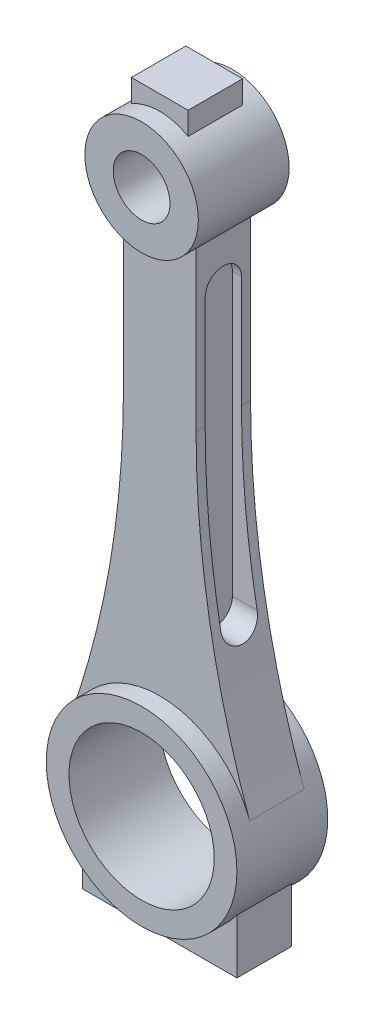
ISO-10303-21;
HEADER;
FILE_DESCRIPTION(('STEP AP214'),'2;1');
FILE_NAME('part.step','',(''),(''),'','','');
FILE_SCHEMA(('AUTOMOTIVE_DESIGN { 1 0 10303 214 1 1 1 1 }'));
ENDSEC;
DATA;
#1=APPLICATION_CONTEXT('core data for automotive mechanical design processes');
#2=APPLICATION_PROTOCOL_DEFINITION('international standard','automotive_design',2000,#1);
#3=PRODUCT_CONTEXT('',#1,'mechanical');
#4=PRODUCT('Part','Part','',(#3));
#5=PRODUCT_RELATED_PRODUCT_CATEGORY('part','',(#4));
#6=PRODUCT_DEFINITION_FORMATION('','',#4);
#7=PRODUCT_DEFINITION_CONTEXT('part definition',#1,'design');
#8=PRODUCT_DEFINITION('design','',#6,#7);
#9=PRODUCT_DEFINITION_SHAPE('','',#8);
#10=(LENGTH_UNIT() NAMED_UNIT(*) SI_UNIT(.MILLI.,.METRE.));
#11=(NAMED_UNIT(*) PLANE_ANGLE_UNIT() SI_UNIT($,.RADIAN.));
#12=(NAMED_UNIT(*) SI_UNIT($,.STERADIAN.) SOLID_ANGLE_UNIT());
#13=UNCERTAINTY_MEASURE_WITH_UNIT(LENGTH_MEASURE(1.E-05),#10,'distance_accuracy_value','');
#14=(GEOMETRIC_REPRESENTATION_CONTEXT(3) GLOBAL_UNCERTAINTY_ASSIGNED_CONTEXT((#13)) GLOBAL_UNIT_ASSIGNED_CONTEXT((#10,
#11,#12)) REPRESENTATION_CONTEXT('',''));
#15=CARTESIAN_POINT('',(0.,0.,0.));
#16=DIRECTION('',(0.,0.,1.));
#17=DIRECTION('',(1.,0.,0.));
#18=AXIS2_PLACEMENT_3D('',#15,#16,#17);
#19=CARTESIAN_POINT('',(212.132819979024,75.3953136438507,6.));
#20=DIRECTION('',(0.,0.,-1.));
#21=DIRECTION('',(-1.,0.,0.));
#22=AXIS2_PLACEMENT_3D('',#19,#20,#21);
#23=CYLINDRICAL_SURFACE('',#22,204.132819979024);
#24=CARTESIAN_POINT('',(11.4544735884215,38.,-4.));
#25=CARTESIAN_POINT('',(11.4757515518411,37.8858086335559,-4.00000967356235));
#26=CARTESIAN_POINT('',(11.497127848932,37.7716411229782,-3.99511012112079));
#27=CARTESIAN_POINT('',(11.5399210356049,37.544152772884,-3.97557755361703));
#28=CARTESIAN_POINT('',(11.5613379239584,37.4308319082382,-3.96094482861379));
#29=CARTESIAN_POINT('',(11.6040518019029,37.2058589467753,-3.92203609087537));
#30=CARTESIAN_POINT('',(11.6253488219802,37.0942064124742,-3.89776265395077));
#31=CARTESIAN_POINT('',(11.6676599337569,36.8733657612217,-3.8397587276263));
#32=CARTESIAN_POINT('',(11.6886740293759,36.7641776101131,-3.80602836938936));
#33=CARTESIAN_POINT('',(11.7510730473326,36.4413470108117,-3.69089420326937));
#34=CARTESIAN_POINT('',(11.7918289081029,36.2323636826891,-3.59553432969807));
#35=CARTESIAN_POINT('',(11.8702126062764,35.833491871712,-3.37027556179513));
#36=CARTESIAN_POINT('',(11.9078413597511,35.643597793309,-3.24038682968163));
#37=CARTESIAN_POINT('',(11.9784728244352,35.2894796680367,-2.950436910244));
#38=CARTESIAN_POINT('',(12.0115036519544,35.1250988255321,-2.79057453802655));
#39=CARTESIAN_POINT('',(12.0720036427705,34.8256035029566,-2.44449926104124));
#40=CARTESIAN_POINT('',(12.0994724370193,34.6904909648341,-2.25828460915733));
#41=CARTESIAN_POINT('',(12.1473413477104,34.4559602912754,-1.86832249559896));
#42=CARTESIAN_POINT('',(12.1678582991115,34.3559510460777,-1.664944991045));
#43=CARTESIAN_POINT('',(12.201667760202,34.1915558050773,-1.24372237948287));
#44=CARTESIAN_POINT('',(12.2149615713728,34.1271633917176,-1.0258798867516));
#45=CARTESIAN_POINT('',(12.2336033492387,34.0369591960168,-0.586274812122699));
#46=CARTESIAN_POINT('',(12.2390950212481,34.0104496060439,-0.364661335561849));
#47=CARTESIAN_POINT('',(12.2423732155318,33.9946184843632,0.0799443502249465));
#48=CARTESIAN_POINT('',(12.2401601145853,34.0052951341723,0.302936491499039));
#49=CARTESIAN_POINT('',(12.2281765408432,34.0632127244266,0.741781925824318));
#50=CARTESIAN_POINT('',(12.2184766498272,34.1101121767816,0.957682365575705));
#51=CARTESIAN_POINT('',(12.1919895794175,34.2385791029979,1.37844153266758));
#52=CARTESIAN_POINT('',(12.1752023313576,34.3201469127454,1.58330015300715));
#53=CARTESIAN_POINT('',(12.1350793834177,34.5159552856904,1.97739776157501));
#54=CARTESIAN_POINT('',(12.1117098081663,34.6303649264094,2.16654921549123));
#55=CARTESIAN_POINT('',(12.0593260749272,34.8882465100265,2.52297125984128));
#56=CARTESIAN_POINT('',(12.0303117725958,35.0317191961119,2.69024129055299));
#57=CARTESIAN_POINT('',(11.9671383735568,35.3461665633751,3.00114206510914));
#58=CARTESIAN_POINT('',(11.9329025496514,35.5175545383741,3.14433904981939));
#59=CARTESIAN_POINT('',(11.8607975408037,35.8812712267655,3.40006280722765));
#60=CARTESIAN_POINT('',(11.8229268395298,36.0736086840292,3.51257670427657));
#61=CARTESIAN_POINT('',(11.744011046999,36.4777513253325,3.70593438635492));
#62=CARTESIAN_POINT('',(11.7029182624971,36.6898643551292,3.78611370956408));
#63=CARTESIAN_POINT('',(11.6195357198389,37.1241795414682,3.90944320644275));
#64=CARTESIAN_POINT('',(11.5772477716993,37.3463667203578,3.95264656840455));
#65=CARTESIAN_POINT('',(11.5215540274852,37.6417241762258,3.98457340087695));
#66=CARTESIAN_POINT('',(11.5080944382148,37.713314753212,3.99036111817269));
#67=CARTESIAN_POINT('',(11.481236818834,37.8565916807733,3.99806924003837));
#68=CARTESIAN_POINT('',(11.4678387235409,37.9282776734255,3.99999606757805));
#69=CARTESIAN_POINT('',(11.4544735884214,38.,4.));
#70=B_SPLINE_CURVE_WITH_KNOTS('',3,(#24,#25,#26,#27,#28,#29,#30,#31,#32,#33,#34,#35,#36,#37,#38,
#39,#40,#41,#42,#43,#44,#45,#46,#47,#48,#49,#50,#51,#52,#53,#54,#55,#56,#57,#58,#59,#60,#61,#62,
#63,#64,#65,#66,#67,#68,#69),.UNSPECIFIED.,.F.,.F.,(4,2,2,2,2,2,2,2,2,2,2,2,2,2,2,2,2,2,2,2,2,2,
4),(0.,0.348357600629778,0.696704820295753,1.044959030908,1.39320841164154,2.0894785742732,
2.78554404346982,3.47714614167072,4.1687941135383,4.84816302804555,5.52740949173435,
6.19397531687089,6.86050854603355,7.52083364695974,8.18116514562693,8.84495910470897,
9.50877004017899,10.1834922182609,10.8584970981523,11.546741507572,12.2339942357505,
12.4531452672714,12.6719314158043),.UNSPECIFIED.);
#71=CARTESIAN_POINT('',(11.4544735884215,38.,-4.));
#72=VERTEX_POINT('',#71);
#73=CARTESIAN_POINT('',(11.4544735884215,38.,4.));
#74=VERTEX_POINT('',#73);
#75=EDGE_CURVE('E12',#72,#74,#70,.T.);
#76=ORIENTED_EDGE('',*,*,#75,.T.);
#77=CARTESIAN_POINT('',(212.132819979024,75.3953136438507,4.));
#78=DIRECTION('',(0.,0.,-1.));
#79=DIRECTION('',(-1.,0.,0.));
#80=AXIS2_PLACEMENT_3D('',#77,#78,#79);
#81=CIRCLE('',#80,204.132819979024);
#82=CARTESIAN_POINT('',(8.,75.3953136438507,4.));
#83=VERTEX_POINT('',#82);
#84=EDGE_CURVE('E245',#74,#83,#81,.T.);
#85=ORIENTED_EDGE('',*,*,#84,.T.);
#86=DIRECTION('',(0.,0.,-1.));
#87=VECTOR('',#86,1.);
#88=CARTESIAN_POINT('',(8.,75.3953136438507,6.));
#89=LINE('',#88,#87);
#90=CARTESIAN_POINT('',(8.,75.3953136438507,6.));
#91=VERTEX_POINT('',#90);
#92=EDGE_CURVE('E394',#91,#83,#89,.T.);
#93=ORIENTED_EDGE('',*,*,#92,.F.);
#94=CARTESIAN_POINT('',(212.132819979024,75.3953136438507,6.));
#95=DIRECTION('',(0.,0.,1.));
#96=DIRECTION('',(1.,0.,0.));
#97=AXIS2_PLACEMENT_3D('',#94,#95,#96);
#98=CIRCLE('',#97,204.132819979024);
#99=CARTESIAN_POINT('',(19.7873824881444,7.03274443356764,6.));
#100=VERTEX_POINT('',#99);
#101=EDGE_CURVE('E346',#91,#100,#98,.T.);
#102=ORIENTED_EDGE('',*,*,#101,.T.);
#103=DIRECTION('',(0.,0.,-1.));
#104=VECTOR('',#103,1.);
#105=CARTESIAN_POINT('',(19.7873824881444,7.03274443356764,6.));
#106=LINE('',#105,#104);
#107=CARTESIAN_POINT('',(19.7873824881444,7.03274443356764,-6.));
#108=VERTEX_POINT('',#107);
#109=EDGE_CURVE('E363',#100,#108,#106,.T.);
#110=ORIENTED_EDGE('',*,*,#109,.T.);
#111=CARTESIAN_POINT('',(212.132819979024,75.3953136438507,-6.));
#112=DIRECTION('',(0.,0.,1.));
#113=DIRECTION('',(1.,0.,0.));
#114=AXIS2_PLACEMENT_3D('',#111,#112,#113);
#115=CIRCLE('',#114,204.132819979024);
#116=CARTESIAN_POINT('',(8.,75.3953136438507,-6.));
#117=VERTEX_POINT('',#116);
#118=EDGE_CURVE('E343',#117,#108,#115,.T.);
#119=ORIENTED_EDGE('',*,*,#118,.F.);
#120=CARTESIAN_POINT('',(8.,75.3953136438507,-4.));
#121=VERTEX_POINT('',#120);
#122=EDGE_CURVE('E393',#121,#117,#89,.T.);
#123=ORIENTED_EDGE('',*,*,#122,.F.);
#124=CARTESIAN_POINT('',(212.132819979024,75.3953136438507,-4.));
#125=DIRECTION('',(0.,0.,1.));
#126=DIRECTION('',(1.,0.,0.));
#127=AXIS2_PLACEMENT_3D('',#124,#125,#126);
#128=CIRCLE('',#127,204.132819979024);
#129=EDGE_CURVE('E66',#121,#72,#128,.T.);
#130=ORIENTED_EDGE('',*,*,#129,.T.);
#131=EDGE_LOOP('',(#76,#85,#93,#102,#110,#119,#123,#130));
#132=FACE_BOUND('',#131,.T.);
#133=ADVANCED_FACE('F45',(#132),#23,.F.);
#134=CARTESIAN_POINT('',(8.,0.,6.));
#135=DIRECTION('',(-1.,0.,0.));
#136=DIRECTION('',(0.,-1.,0.));
#137=AXIS2_PLACEMENT_3D('',#134,#135,#136);
#138=PLANE('',#137);
#139=DIRECTION('',(0.,-1.,0.));
#140=VECTOR('',#139,1.);
#141=CARTESIAN_POINT('',(8.,0.,4.));
#142=LINE('',#141,#140);
#143=CARTESIAN_POINT('',(8.,100.,4.));
#144=VERTEX_POINT('',#143);
#145=EDGE_CURVE('E59',#144,#83,#142,.T.);
#146=ORIENTED_EDGE('',*,*,#145,.F.);
#147=CARTESIAN_POINT('',(8.,100.,0.));
#148=DIRECTION('',(-1.,0.,0.));
#149=DIRECTION('',(0.,-1.,0.));
#150=AXIS2_PLACEMENT_3D('',#147,#148,#149);
#151=CIRCLE('',#150,4.);
#152=CARTESIAN_POINT('',(8.,100.,-4.));
#153=VERTEX_POINT('',#152);
#154=EDGE_CURVE('E573',#153,#144,#151,.F.);
#155=ORIENTED_EDGE('',*,*,#154,.F.);
#156=DIRECTION('',(0.,1.,0.));
#157=VECTOR('',#156,1.);
#158=CARTESIAN_POINT('',(8.,0.,-4.));
#159=LINE('',#158,#157);
#160=EDGE_CURVE('E216',#121,#153,#159,.T.);
#161=ORIENTED_EDGE('',*,*,#160,.F.);
#162=ORIENTED_EDGE('',*,*,#122,.T.);
#163=DIRECTION('',(0.,1.,0.));
#164=VECTOR('',#163,1.);
#165=CARTESIAN_POINT('',(8.,0.,-6.));
#166=LINE('',#165,#164);
#167=CARTESIAN_POINT('',(8.,110.395313643851,-6.));
#168=VERTEX_POINT('',#167);
#169=EDGE_CURVE('E366',#117,#168,#166,.T.);
#170=ORIENTED_EDGE('',*,*,#169,.T.);
#171=DIRECTION('',(0.,0.,-1.));
#172=VECTOR('',#171,1.);
#173=CARTESIAN_POINT('',(8.,110.395313643851,6.));
#174=LINE('',#173,#172);
#175=CARTESIAN_POINT('',(8.,110.395313643851,6.));
#176=VERTEX_POINT('',#175);
#177=EDGE_CURVE('E391',#176,#168,#174,.T.);
#178=ORIENTED_EDGE('',*,*,#177,.F.);
#179=DIRECTION('',(0.,1.,0.));
#180=VECTOR('',#179,1.);
#181=CARTESIAN_POINT('',(8.,0.,6.));
#182=LINE('',#181,#180);
#183=EDGE_CURVE('E349',#91,#176,#182,.T.);
#184=ORIENTED_EDGE('',*,*,#183,.F.);
#185=ORIENTED_EDGE('',*,*,#92,.T.);
#186=EDGE_LOOP('',(#146,#155,#161,#162,#170,#178,#184,#185));
#187=FACE_BOUND('',#186,.T.);
#188=ADVANCED_FACE('F508',(#187),#138,.F.);
#189=CARTESIAN_POINT('',(0.,120.,10.));
#190=DIRECTION('',(0.,0.,1.));
#191=DIRECTION('',(1.,0.,0.));
#192=AXIS2_PLACEMENT_3D('',#189,#190,#191);
#193=PLANE('',#192);
#194=CARTESIAN_POINT('',(0.,120.,10.));
#195=DIRECTION('',(0.,0.,1.));
#196=DIRECTION('',(1.,0.,0.));
#197=AXIS2_PLACEMENT_3D('',#194,#195,#196);
#198=CIRCLE('',#197,12.5);
#199=CARTESIAN_POINT('',(12.5,120.,10.));
#200=VERTEX_POINT('',#199);
#201=EDGE_CURVE('E404',#200,#200,#198,.T.);
#202=ORIENTED_EDGE('',*,*,#201,.T.);
#203=EDGE_LOOP('',(#202));
#204=FACE_BOUND('',#203,.T.);
#205=CARTESIAN_POINT('',(0.,120.,10.));
#206=DIRECTION('',(0.,0.,1.));
#207=DIRECTION('',(1.,0.,0.));
#208=AXIS2_PLACEMENT_3D('',#205,#206,#207);
#209=CIRCLE('',#208,6.25);
#210=CARTESIAN_POINT('',(6.25,120.,10.));
#211=VERTEX_POINT('',#210);
#212=EDGE_CURVE('E398',#211,#211,#209,.T.);
#213=ORIENTED_EDGE('',*,*,#212,.F.);
#214=EDGE_LOOP('',(#213));
#215=FACE_BOUND('',#214,.T.);
#216=ADVANCED_FACE('F513',(#204,#215),#193,.T.);
#217=CARTESIAN_POINT('',(0.,120.,-10.));
#218=DIRECTION('',(0.,0.,1.));
#219=DIRECTION('',(1.,0.,0.));
#220=AXIS2_PLACEMENT_3D('',#217,#218,#219);
#221=PLANE('',#220);
#222=CARTESIAN_POINT('',(0.,120.,-10.));
#223=DIRECTION('',(0.,0.,1.));
#224=DIRECTION('',(1.,0.,0.));
#225=AXIS2_PLACEMENT_3D('',#222,#223,#224);
#226=CIRCLE('',#225,12.5);
#227=CARTESIAN_POINT('',(12.5,120.,-10.));
#228=VERTEX_POINT('',#227);
#229=EDGE_CURVE('E401',#228,#228,#226,.T.);
#230=ORIENTED_EDGE('',*,*,#229,.F.);
#231=EDGE_LOOP('',(#230));
#232=FACE_BOUND('',#231,.T.);
#233=CARTESIAN_POINT('',(0.,120.,-10.));
#234=DIRECTION('',(0.,0.,1.));
#235=DIRECTION('',(1.,0.,0.));
#236=AXIS2_PLACEMENT_3D('',#233,#234,#235);
#237=CIRCLE('',#236,6.25);
#238=CARTESIAN_POINT('',(6.25,120.,-10.));
#239=VERTEX_POINT('',#238);
#240=EDGE_CURVE('E397',#239,#239,#237,.T.);
#241=ORIENTED_EDGE('',*,*,#240,.T.);
#242=EDGE_LOOP('',(#241));
#243=FACE_BOUND('',#242,.T.);
#244=ADVANCED_FACE('F524',(#232,#243),#221,.F.);
#245=CARTESIAN_POINT('',(0.,120.,10.));
#246=DIRECTION('',(0.,0.,-1.));
#247=DIRECTION('',(-1.,0.,0.));
#248=AXIS2_PLACEMENT_3D('',#245,#246,#247);
#249=CYLINDRICAL_SURFACE('',#248,12.5);
#250=DIRECTION('',(0.,0.,-1.));
#251=VECTOR('',#250,1.);
#252=CARTESIAN_POINT('',(6.25,130.825317547305,6.));
#253=LINE('',#252,#251);
#254=CARTESIAN_POINT('',(6.25,130.825317547305,6.));
#255=VERTEX_POINT('',#254);
#256=CARTESIAN_POINT('',(6.25,130.825317547305,-6.));
#257=VERTEX_POINT('',#256);
#258=EDGE_CURVE('E330',#255,#257,#253,.T.);
#259=ORIENTED_EDGE('',*,*,#258,.F.);
#260=CARTESIAN_POINT('',(0.,120.,6.));
#261=DIRECTION('',(0.,0.,1.));
#262=DIRECTION('',(1.,0.,0.));
#263=AXIS2_PLACEMENT_3D('',#260,#261,#262);
#264=CIRCLE('',#263,12.5);
#265=CARTESIAN_POINT('',(-6.25,130.825317547305,6.));
#266=VERTEX_POINT('',#265);
#267=EDGE_CURVE('E302',#255,#266,#264,.T.);
#268=ORIENTED_EDGE('',*,*,#267,.T.);
#269=DIRECTION('',(0.,0.,-1.));
#270=VECTOR('',#269,1.);
#271=CARTESIAN_POINT('',(-6.25,130.825317547305,6.));
#272=LINE('',#271,#270);
#273=CARTESIAN_POINT('',(-6.25,130.825317547305,-6.));
#274=VERTEX_POINT('',#273);
#275=EDGE_CURVE('E314',#266,#274,#272,.T.);
#276=ORIENTED_EDGE('',*,*,#275,.T.);
#277=CARTESIAN_POINT('',(0.,120.,-6.));
#278=DIRECTION('',(0.,0.,1.));
#279=DIRECTION('',(1.,0.,0.));
#280=AXIS2_PLACEMENT_3D('',#277,#278,#279);
#281=CIRCLE('',#280,12.5);
#282=EDGE_CURVE('E301',#257,#274,#281,.T.);
#283=ORIENTED_EDGE('',*,*,#282,.F.);
#284=EDGE_LOOP('',(#259,#268,#276,#283));
#285=FACE_BOUND('',#284,.T.);
#286=DIRECTION('',(0.,0.,-1.));
#287=VECTOR('',#286,1.);
#288=CARTESIAN_POINT('',(-8.,110.395313643851,6.));
#289=LINE('',#288,#287);
#290=CARTESIAN_POINT('',(-8.,110.395313643851,6.));
#291=VERTEX_POINT('',#290);
#292=CARTESIAN_POINT('',(-8.,110.395313643851,-6.));
#293=VERTEX_POINT('',#292);
#294=EDGE_CURVE('E388',#291,#293,#289,.T.);
#295=ORIENTED_EDGE('',*,*,#294,.F.);
#296=CARTESIAN_POINT('',(0.,120.,6.));
#297=DIRECTION('',(0.,0.,1.));
#298=DIRECTION('',(1.,0.,0.));
#299=AXIS2_PLACEMENT_3D('',#296,#297,#298);
#300=CIRCLE('',#299,12.5);
#301=EDGE_CURVE('E353',#291,#176,#300,.T.);
#302=ORIENTED_EDGE('',*,*,#301,.T.);
#303=ORIENTED_EDGE('',*,*,#177,.T.);
#304=CARTESIAN_POINT('',(0.,120.,-6.));
#305=DIRECTION('',(0.,0.,1.));
#306=DIRECTION('',(1.,0.,0.));
#307=AXIS2_PLACEMENT_3D('',#304,#305,#306);
#308=CIRCLE('',#307,12.5);
#309=EDGE_CURVE('E369',#293,#168,#308,.T.);
#310=ORIENTED_EDGE('',*,*,#309,.F.);
#311=EDGE_LOOP('',(#295,#302,#303,#310));
#312=FACE_BOUND('',#311,.T.);
#313=ORIENTED_EDGE('',*,*,#201,.F.);
#314=EDGE_LOOP('',(#313));
#315=FACE_BOUND('',#314,.T.);
#316=ORIENTED_EDGE('',*,*,#229,.T.);
#317=EDGE_LOOP('',(#316));
#318=FACE_BOUND('',#317,.T.);
#319=ADVANCED_FACE('F47',(#285,#312,#315,#318),#249,.T.);
#320=CARTESIAN_POINT('',(0.,120.,10.));
#321=DIRECTION('',(0.,0.,-1.));
#322=DIRECTION('',(-1.,0.,0.));
#323=AXIS2_PLACEMENT_3D('',#320,#321,#322);
#324=CYLINDRICAL_SURFACE('',#323,6.25);
#325=ORIENTED_EDGE('',*,*,#212,.T.);
#326=EDGE_LOOP('',(#325));
#327=FACE_BOUND('',#326,.T.);
#328=ORIENTED_EDGE('',*,*,#240,.F.);
#329=EDGE_LOOP('',(#328));
#330=FACE_BOUND('',#329,.T.);
#331=ADVANCED_FACE('F518',(#327,#330),#324,.F.);
#332=CARTESIAN_POINT('',(-8.,0.,6.));
#333=DIRECTION('',(-1.,0.,0.));
#334=DIRECTION('',(0.,-1.,0.));
#335=AXIS2_PLACEMENT_3D('',#332,#333,#334);
#336=PLANE('',#335);
#337=DIRECTION('',(0.,-1.,0.));
#338=VECTOR('',#337,1.);
#339=CARTESIAN_POINT('',(-8.,0.,-4.));
#340=LINE('',#339,#338);
#341=CARTESIAN_POINT('',(-8.,100.,-4.));
#342=VERTEX_POINT('',#341);
#343=CARTESIAN_POINT('',(-7.99999999999995,75.3953136438507,-4.));
#344=VERTEX_POINT('',#343);
#345=EDGE_CURVE('E268',#342,#344,#340,.T.);
#346=ORIENTED_EDGE('',*,*,#345,.F.);
#347=CARTESIAN_POINT('',(-8.,100.,0.));
#348=DIRECTION('',(-1.,0.,0.));
#349=DIRECTION('',(0.,-1.,0.));
#350=AXIS2_PLACEMENT_3D('',#347,#348,#349);
#351=CIRCLE('',#350,4.);
#352=CARTESIAN_POINT('',(-8.,100.,4.));
#353=VERTEX_POINT('',#352);
#354=EDGE_CURVE('E570',#353,#342,#351,.T.);
#355=ORIENTED_EDGE('',*,*,#354,.F.);
#356=DIRECTION('',(0.,1.,0.));
#357=VECTOR('',#356,1.);
#358=CARTESIAN_POINT('',(-8.,0.,4.));
#359=LINE('',#358,#357);
#360=CARTESIAN_POINT('',(-7.99999999999998,75.3953136438507,4.));
#361=VERTEX_POINT('',#360);
#362=EDGE_CURVE('E262',#361,#353,#359,.T.);
#363=ORIENTED_EDGE('',*,*,#362,.F.);
#364=DIRECTION('',(0.,0.,-1.));
#365=VECTOR('',#364,1.);
#366=CARTESIAN_POINT('',(-8.,75.3953136438507,6.));
#367=LINE('',#366,#365);
#368=CARTESIAN_POINT('',(-8.,75.3953136438507,6.));
#369=VERTEX_POINT('',#368);
#370=EDGE_CURVE('E385',#369,#361,#367,.T.);
#371=ORIENTED_EDGE('',*,*,#370,.F.);
#372=DIRECTION('',(0.,1.,0.));
#373=VECTOR('',#372,1.);
#374=CARTESIAN_POINT('',(-8.,0.,6.));
#375=LINE('',#374,#373);
#376=EDGE_CURVE('E355',#369,#291,#375,.T.);
#377=ORIENTED_EDGE('',*,*,#376,.T.);
#378=ORIENTED_EDGE('',*,*,#294,.T.);
#379=DIRECTION('',(0.,1.,0.));
#380=VECTOR('',#379,1.);
#381=CARTESIAN_POINT('',(-8.,0.,-6.));
#382=LINE('',#381,#380);
#383=CARTESIAN_POINT('',(-8.,75.3953136438507,-6.));
#384=VERTEX_POINT('',#383);
#385=EDGE_CURVE('E372',#384,#293,#382,.T.);
#386=ORIENTED_EDGE('',*,*,#385,.F.);
#387=EDGE_CURVE('E384',#344,#384,#367,.T.);
#388=ORIENTED_EDGE('',*,*,#387,.F.);
#389=EDGE_LOOP('',(#346,#355,#363,#371,#377,#378,#386,#388));
#390=FACE_BOUND('',#389,.T.);
#391=ADVANCED_FACE('F521',(#390),#336,.T.);
#392=CARTESIAN_POINT('',(-212.132819979024,75.3953136438507,6.));
#393=DIRECTION('',(0.,0.,-1.));
#394=DIRECTION('',(-1.,0.,0.));
#395=AXIS2_PLACEMENT_3D('',#392,#393,#394);
#396=CYLINDRICAL_SURFACE('',#395,204.132819979024);
#397=CARTESIAN_POINT('',(-11.4544735884215,38.,4.));
#398=CARTESIAN_POINT('',(-11.4757515518411,37.8858086335559,4.00000967356235));
#399=CARTESIAN_POINT('',(-11.497127848932,37.7716411229782,3.99511012112079));
#400=CARTESIAN_POINT('',(-11.5399210356049,37.544152772884,3.97557755361703));
#401=CARTESIAN_POINT('',(-11.5613379239584,37.4308319082382,3.96094482861379));
#402=CARTESIAN_POINT('',(-11.6040518019029,37.2058589467753,3.92203609087537));
#403=CARTESIAN_POINT('',(-11.6253488219802,37.0942064124742,3.89776265395077));
#404=CARTESIAN_POINT('',(-11.6676599337569,36.8733657612217,3.8397587276263));
#405=CARTESIAN_POINT('',(-11.6886740293759,36.7641776101131,3.80602836938936));
#406=CARTESIAN_POINT('',(-11.7510730473326,36.4413470108117,3.69089420326937));
#407=CARTESIAN_POINT('',(-11.7918289081029,36.2323636826891,3.59553432969807));
#408=CARTESIAN_POINT('',(-11.8702126062764,35.833491871712,3.37027556179513));
#409=CARTESIAN_POINT('',(-11.9078413597511,35.643597793309,3.24038682968163));
#410=CARTESIAN_POINT('',(-11.9784728244352,35.2894796680367,2.950436910244));
#411=CARTESIAN_POINT('',(-12.0115036519544,35.1250988255321,2.79057453802655));
#412=CARTESIAN_POINT('',(-12.0720036427705,34.8256035029566,2.44449926104124));
#413=CARTESIAN_POINT('',(-12.0994724370193,34.6904909648341,2.25828460915733));
#414=CARTESIAN_POINT('',(-12.1473413477104,34.4559602912754,1.86832249559896));
#415=CARTESIAN_POINT('',(-12.1678582991115,34.3559510460777,1.664944991045));
#416=CARTESIAN_POINT('',(-12.201667760202,34.1915558050773,1.24372237948287));
#417=CARTESIAN_POINT('',(-12.2149615713728,34.1271633917176,1.0258798867516));
#418=CARTESIAN_POINT('',(-12.2336033492387,34.0369591960168,0.586274812122699));
#419=CARTESIAN_POINT('',(-12.2390950212481,34.0104496060439,0.364661335561849));
#420=CARTESIAN_POINT('',(-12.2423732155318,33.9946184843632,-0.0799443502249465));
#421=CARTESIAN_POINT('',(-12.2401601145853,34.0052951341723,-0.302936491499039));
#422=CARTESIAN_POINT('',(-12.2281765408432,34.0632127244266,-0.741781925824318));
#423=CARTESIAN_POINT('',(-12.2184766498272,34.1101121767816,-0.957682365575705));
#424=CARTESIAN_POINT('',(-12.1919895794175,34.2385791029979,-1.37844153266758));
#425=CARTESIAN_POINT('',(-12.1752023313576,34.3201469127454,-1.58330015300715));
#426=CARTESIAN_POINT('',(-12.1350793834177,34.5159552856904,-1.97739776157501));
#427=CARTESIAN_POINT('',(-12.1117098081663,34.6303649264094,-2.16654921549123));
#428=CARTESIAN_POINT('',(-12.0593260749272,34.8882465100265,-2.52297125984128));
#429=CARTESIAN_POINT('',(-12.0303117725958,35.0317191961119,-2.69024129055299));
#430=CARTESIAN_POINT('',(-11.9671383735568,35.3461665633751,-3.00114206510914));
#431=CARTESIAN_POINT('',(-11.9329025496514,35.5175545383741,-3.14433904981939));
#432=CARTESIAN_POINT('',(-11.8607975408037,35.8812712267655,-3.40006280722765));
#433=CARTESIAN_POINT('',(-11.8229268395298,36.0736086840292,-3.51257670427657));
#434=CARTESIAN_POINT('',(-11.744011046999,36.4777513253325,-3.70593438635492));
#435=CARTESIAN_POINT('',(-11.7029182624971,36.6898643551292,-3.78611370956408));
#436=CARTESIAN_POINT('',(-11.6195357198389,37.1241795414682,-3.90944320644275));
#437=CARTESIAN_POINT('',(-11.5772477716993,37.3463667203578,-3.95264656840455));
#438=CARTESIAN_POINT('',(-11.5215540274852,37.6417241762258,-3.98457340087695));
#439=CARTESIAN_POINT('',(-11.5080944382148,37.713314753212,-3.99036111817269));
#440=CARTESIAN_POINT('',(-11.481236818834,37.8565916807733,-3.99806924003837));
#441=CARTESIAN_POINT('',(-11.4678387235409,37.9282776734255,-3.99999606757805));
#442=CARTESIAN_POINT('',(-11.4544735884214,38.,-4.));
#443=B_SPLINE_CURVE_WITH_KNOTS('',3,(#397,#398,#399,#400,#401,#402,#403,#404,#405,#406,#407,
#408,#409,#410,#411,#412,#413,#414,#415,#416,#417,#418,#419,#420,#421,#422,#423,#424,#425,#426,
#427,#428,#429,#430,#431,#432,#433,#434,#435,#436,#437,#438,#439,#440,#441,#442),.UNSPECIFIED.,
.F.,.F.,(4,2,2,2,2,2,2,2,2,2,2,2,2,2,2,2,2,2,2,2,2,2,4),(0.,0.348357600629778,0.696704820295753,
1.044959030908,1.39320841164154,2.0894785742732,2.78554404346982,3.47714614167072,
4.1687941135383,4.84816302804555,5.52740949173435,6.19397531687089,6.86050854603355,
7.52083364695974,8.18116514562693,8.84495910470897,9.50877004017899,10.1834922182609,
10.8584970981523,11.546741507572,12.2339942357505,12.4531452672714,12.6719314158043),.UNSPECIFIED.);
#444=CARTESIAN_POINT('',(-11.4544735884215,38.,4.));
#445=VERTEX_POINT('',#444);
#446=CARTESIAN_POINT('',(-11.4544735884215,38.,-4.));
#447=VERTEX_POINT('',#446);
#448=EDGE_CURVE('E412',#445,#447,#443,.T.);
#449=ORIENTED_EDGE('',*,*,#448,.T.);
#450=CARTESIAN_POINT('',(-212.132819979024,75.3953136438507,-4.));
#451=DIRECTION('',(0.,0.,-1.));
#452=DIRECTION('',(-1.,0.,0.));
#453=AXIS2_PLACEMENT_3D('',#450,#451,#452);
#454=CIRCLE('',#453,204.132819979024);
#455=EDGE_CURVE('E421',#447,#344,#454,.F.);
#456=ORIENTED_EDGE('',*,*,#455,.T.);
#457=ORIENTED_EDGE('',*,*,#387,.T.);
#458=CARTESIAN_POINT('',(-212.132819979024,75.3953136438507,-6.));
#459=DIRECTION('',(0.,0.,1.));
#460=DIRECTION('',(1.,0.,0.));
#461=AXIS2_PLACEMENT_3D('',#458,#459,#460);
#462=CIRCLE('',#461,204.132819979024);
#463=CARTESIAN_POINT('',(-19.7873824881444,7.03274443356764,-6.));
#464=VERTEX_POINT('',#463);
#465=EDGE_CURVE('E375',#384,#464,#462,.F.);
#466=ORIENTED_EDGE('',*,*,#465,.T.);
#467=DIRECTION('',(0.,0.,-1.));
#468=VECTOR('',#467,1.);
#469=CARTESIAN_POINT('',(-19.7873824881444,7.03274443356764,6.));
#470=LINE('',#469,#468);
#471=CARTESIAN_POINT('',(-19.7873824881444,7.03274443356764,6.));
#472=VERTEX_POINT('',#471);
#473=EDGE_CURVE('E382',#472,#464,#470,.T.);
#474=ORIENTED_EDGE('',*,*,#473,.F.);
#475=CARTESIAN_POINT('',(-212.132819979024,75.3953136438507,6.));
#476=DIRECTION('',(0.,0.,1.));
#477=DIRECTION('',(1.,0.,0.));
#478=AXIS2_PLACEMENT_3D('',#475,#476,#477);
#479=CIRCLE('',#478,204.132819979024);
#480=EDGE_CURVE('E358',#369,#472,#479,.F.);
#481=ORIENTED_EDGE('',*,*,#480,.F.);
#482=ORIENTED_EDGE('',*,*,#370,.T.);
#483=CARTESIAN_POINT('',(-212.132819979024,75.3953136438507,4.));
#484=DIRECTION('',(0.,0.,1.));
#485=DIRECTION('',(1.,0.,0.));
#486=AXIS2_PLACEMENT_3D('',#483,#484,#485);
#487=CIRCLE('',#486,204.132819979024);
#488=EDGE_CURVE('E407',#361,#445,#487,.F.);
#489=ORIENTED_EDGE('',*,*,#488,.T.);
#490=EDGE_LOOP('',(#449,#456,#457,#466,#474,#481,#482,#489));
#491=FACE_BOUND('',#490,.T.);
#492=ADVANCED_FACE('F423',(#491),#396,.F.);
#493=CARTESIAN_POINT('',(0.,0.,6.));
#494=DIRECTION('',(0.,0.,1.));
#495=DIRECTION('',(1.,0.,0.));
#496=AXIS2_PLACEMENT_3D('',#493,#494,#495);
#497=PLANE('',#496);
#498=ORIENTED_EDGE('',*,*,#101,.F.);
#499=ORIENTED_EDGE('',*,*,#183,.T.);
#500=ORIENTED_EDGE('',*,*,#301,.F.);
#501=ORIENTED_EDGE('',*,*,#376,.F.);
#502=ORIENTED_EDGE('',*,*,#480,.T.);
#503=CARTESIAN_POINT('',(0.,0.,6.));
#504=DIRECTION('',(0.,0.,1.));
#505=DIRECTION('',(1.,0.,0.));
#506=AXIS2_PLACEMENT_3D('',#503,#504,#505);
#507=CIRCLE('',#506,21.);
#508=EDGE_CURVE('E361',#100,#472,#507,.T.);
#509=ORIENTED_EDGE('',*,*,#508,.F.);
#510=EDGE_LOOP('',(#498,#499,#500,#501,#502,#509));
#511=FACE_BOUND('',#510,.T.);
#512=ADVANCED_FACE('F500',(#511),#497,.T.);
#513=CARTESIAN_POINT('',(0.,0.,-6.));
#514=DIRECTION('',(0.,0.,1.));
#515=DIRECTION('',(1.,0.,0.));
#516=AXIS2_PLACEMENT_3D('',#513,#514,#515);
#517=PLANE('',#516);
#518=ORIENTED_EDGE('',*,*,#118,.T.);
#519=CARTESIAN_POINT('',(0.,0.,-6.));
#520=DIRECTION('',(0.,0.,1.));
#521=DIRECTION('',(1.,0.,0.));
#522=AXIS2_PLACEMENT_3D('',#519,#520,#521);
#523=CIRCLE('',#522,21.);
#524=EDGE_CURVE('E350',#108,#464,#523,.T.);
#525=ORIENTED_EDGE('',*,*,#524,.T.);
#526=ORIENTED_EDGE('',*,*,#465,.F.);
#527=ORIENTED_EDGE('',*,*,#385,.T.);
#528=ORIENTED_EDGE('',*,*,#309,.T.);
#529=ORIENTED_EDGE('',*,*,#169,.F.);
#530=EDGE_LOOP('',(#518,#525,#526,#527,#528,#529));
#531=FACE_BOUND('',#530,.T.);
#532=ADVANCED_FACE('F495',(#531),#517,.F.);
#533=CARTESIAN_POINT('',(0.,0.,10.));
#534=DIRECTION('',(0.,0.,1.));
#535=DIRECTION('',(1.,0.,0.));
#536=AXIS2_PLACEMENT_3D('',#533,#534,#535);
#537=PLANE('',#536);
#538=CARTESIAN_POINT('',(0.,0.,10.));
#539=DIRECTION('',(0.,0.,1.));
#540=DIRECTION('',(1.,0.,0.));
#541=AXIS2_PLACEMENT_3D('',#538,#539,#540);
#542=CIRCLE('',#541,21.);
#543=CARTESIAN_POINT('',(21.,0.,10.));
#544=VERTEX_POINT('',#543);
#545=EDGE_CURVE('E333',#544,#544,#542,.T.);
#546=ORIENTED_EDGE('',*,*,#545,.T.);
#547=EDGE_LOOP('',(#546));
#548=FACE_BOUND('',#547,.T.);
#549=CARTESIAN_POINT('',(0.,0.,10.));
#550=DIRECTION('',(0.,0.,1.));
#551=DIRECTION('',(1.,0.,0.));
#552=AXIS2_PLACEMENT_3D('',#549,#550,#551);
#553=CIRCLE('',#552,16.);
#554=CARTESIAN_POINT('',(16.,0.,10.));
#555=VERTEX_POINT('',#554);
#556=EDGE_CURVE('E337',#555,#555,#553,.T.);
#557=ORIENTED_EDGE('',*,*,#556,.F.);
#558=EDGE_LOOP('',(#557));
#559=FACE_BOUND('',#558,.T.);
#560=ADVANCED_FACE('F491',(#548,#559),#537,.T.);
#561=CARTESIAN_POINT('',(0.,0.,-10.));
#562=DIRECTION('',(0.,0.,1.));
#563=DIRECTION('',(1.,0.,0.));
#564=AXIS2_PLACEMENT_3D('',#561,#562,#563);
#565=PLANE('',#564);
#566=CARTESIAN_POINT('',(0.,0.,-10.));
#567=DIRECTION('',(0.,0.,1.));
#568=DIRECTION('',(1.,0.,0.));
#569=AXIS2_PLACEMENT_3D('',#566,#567,#568);
#570=CIRCLE('',#569,21.);
#571=CARTESIAN_POINT('',(21.,0.,-10.));
#572=VERTEX_POINT('',#571);
#573=EDGE_CURVE('E334',#572,#572,#570,.T.);
#574=ORIENTED_EDGE('',*,*,#573,.F.);
#575=EDGE_LOOP('',(#574));
#576=FACE_BOUND('',#575,.T.);
#577=CARTESIAN_POINT('',(0.,0.,-10.));
#578=DIRECTION('',(0.,0.,1.));
#579=DIRECTION('',(1.,0.,0.));
#580=AXIS2_PLACEMENT_3D('',#577,#578,#579);
#581=CIRCLE('',#580,16.);
#582=CARTESIAN_POINT('',(16.,0.,-10.));
#583=VERTEX_POINT('',#582);
#584=EDGE_CURVE('E340',#583,#583,#581,.T.);
#585=ORIENTED_EDGE('',*,*,#584,.T.);
#586=EDGE_LOOP('',(#585));
#587=FACE_BOUND('',#586,.T.);
#588=ADVANCED_FACE('F487',(#576,#587),#565,.F.);
#589=CARTESIAN_POINT('',(0.,0.,10.));
#590=DIRECTION('',(0.,0.,-1.));
#591=DIRECTION('',(-1.,0.,0.));
#592=AXIS2_PLACEMENT_3D('',#589,#590,#591);
#593=CYLINDRICAL_SURFACE('',#592,21.);
#594=DIRECTION('',(0.,0.,-1.));
#595=VECTOR('',#594,1.);
#596=CARTESIAN_POINT('',(-17.,-12.328828005938,6.));
#597=LINE('',#596,#595);
#598=CARTESIAN_POINT('',(-17.,-12.328828005938,6.));
#599=VERTEX_POINT('',#598);
#600=CARTESIAN_POINT('',(-17.,-12.328828005938,-6.));
#601=VERTEX_POINT('',#600);
#602=EDGE_CURVE('E298',#599,#601,#597,.T.);
#603=ORIENTED_EDGE('',*,*,#602,.F.);
#604=CARTESIAN_POINT('',(0.,0.,6.));
#605=DIRECTION('',(0.,0.,1.));
#606=DIRECTION('',(1.,0.,0.));
#607=AXIS2_PLACEMENT_3D('',#604,#605,#606);
#608=CIRCLE('',#607,21.);
#609=CARTESIAN_POINT('',(17.,-12.328828005938,6.));
#610=VERTEX_POINT('',#609);
#611=EDGE_CURVE('E271',#599,#610,#608,.T.);
#612=ORIENTED_EDGE('',*,*,#611,.T.);
#613=DIRECTION('',(0.,0.,-1.));
#614=VECTOR('',#613,1.);
#615=CARTESIAN_POINT('',(17.,-12.328828005938,6.));
#616=LINE('',#615,#614);
#617=CARTESIAN_POINT('',(17.,-12.328828005938,-6.));
#618=VERTEX_POINT('',#617);
#619=EDGE_CURVE('E282',#610,#618,#616,.T.);
#620=ORIENTED_EDGE('',*,*,#619,.T.);
#621=CARTESIAN_POINT('',(0.,0.,-6.));
#622=DIRECTION('',(0.,0.,1.));
#623=DIRECTION('',(1.,0.,0.));
#624=AXIS2_PLACEMENT_3D('',#621,#622,#623);
#625=CIRCLE('',#624,21.);
#626=EDGE_CURVE('E270',#601,#618,#625,.T.);
#627=ORIENTED_EDGE('',*,*,#626,.F.);
#628=EDGE_LOOP('',(#603,#612,#620,#627));
#629=FACE_BOUND('',#628,.T.);
#630=ORIENTED_EDGE('',*,*,#508,.T.);
#631=ORIENTED_EDGE('',*,*,#473,.T.);
#632=ORIENTED_EDGE('',*,*,#524,.F.);
#633=ORIENTED_EDGE('',*,*,#109,.F.);
#634=EDGE_LOOP('',(#630,#631,#632,#633));
#635=FACE_BOUND('',#634,.T.);
#636=ORIENTED_EDGE('',*,*,#545,.F.);
#637=EDGE_LOOP('',(#636));
#638=FACE_BOUND('',#637,.T.);
#639=ORIENTED_EDGE('',*,*,#573,.T.);
#640=EDGE_LOOP('',(#639));
#641=FACE_BOUND('',#640,.T.);
#642=ADVANCED_FACE('F484',(#629,#635,#638,#641),#593,.T.);
#643=CARTESIAN_POINT('',(0.,0.,10.));
#644=DIRECTION('',(0.,0.,-1.));
#645=DIRECTION('',(-1.,0.,0.));
#646=AXIS2_PLACEMENT_3D('',#643,#644,#645);
#647=CYLINDRICAL_SURFACE('',#646,16.);
#648=ORIENTED_EDGE('',*,*,#556,.T.);
#649=EDGE_LOOP('',(#648));
#650=FACE_BOUND('',#649,.T.);
#651=ORIENTED_EDGE('',*,*,#584,.F.);
#652=EDGE_LOOP('',(#651));
#653=FACE_BOUND('',#652,.T.);
#654=ADVANCED_FACE('F482',(#650,#653),#647,.F.);
#655=CARTESIAN_POINT('',(6.25000000000005,0.,6.));
#656=DIRECTION('',(1.,0.,0.));
#657=DIRECTION('',(0.,1.,0.));
#658=AXIS2_PLACEMENT_3D('',#655,#656,#657);
#659=PLANE('',#658);
#660=DIRECTION('',(0.,-1.,0.));
#661=VECTOR('',#660,1.);
#662=CARTESIAN_POINT('',(6.25000000000005,0.,-6.));
#663=LINE('',#662,#661);
#664=CARTESIAN_POINT('',(6.25,135.825317547305,-6.));
#665=VERTEX_POINT('',#664);
#666=EDGE_CURVE('E317',#665,#257,#663,.T.);
#667=ORIENTED_EDGE('',*,*,#666,.F.);
#668=DIRECTION('',(0.,0.,-1.));
#669=VECTOR('',#668,1.);
#670=CARTESIAN_POINT('',(6.25,135.825317547305,6.));
#671=LINE('',#670,#669);
#672=CARTESIAN_POINT('',(6.25,135.825317547305,6.));
#673=VERTEX_POINT('',#672);
#674=EDGE_CURVE('E328',#673,#665,#671,.T.);
#675=ORIENTED_EDGE('',*,*,#674,.F.);
#676=DIRECTION('',(0.,-1.,0.));
#677=VECTOR('',#676,1.);
#678=CARTESIAN_POINT('',(6.25000000000005,0.,6.));
#679=LINE('',#678,#677);
#680=EDGE_CURVE('E304',#673,#255,#679,.T.);
#681=ORIENTED_EDGE('',*,*,#680,.T.);
#682=ORIENTED_EDGE('',*,*,#258,.T.);
#683=EDGE_LOOP('',(#667,#675,#681,#682));
#684=FACE_BOUND('',#683,.T.);
#685=ADVANCED_FACE('F478',(#684),#659,.T.);
#686=CARTESIAN_POINT('',(0.,135.825317547305,6.));
#687=DIRECTION('',(0.,1.,0.));
#688=DIRECTION('',(0.,0.,1.));
#689=AXIS2_PLACEMENT_3D('',#686,#687,#688);
#690=PLANE('',#689);
#691=DIRECTION('',(1.,0.,0.));
#692=VECTOR('',#691,1.);
#693=CARTESIAN_POINT('',(0.,135.825317547305,-6.));
#694=LINE('',#693,#692);
#695=CARTESIAN_POINT('',(-6.25,135.825317547305,-6.));
#696=VERTEX_POINT('',#695);
#697=EDGE_CURVE('E320',#696,#665,#694,.T.);
#698=ORIENTED_EDGE('',*,*,#697,.F.);
#699=DIRECTION('',(0.,0.,-1.));
#700=VECTOR('',#699,1.);
#701=CARTESIAN_POINT('',(-6.25,135.825317547305,6.));
#702=LINE('',#701,#700);
#703=CARTESIAN_POINT('',(-6.25,135.825317547305,6.));
#704=VERTEX_POINT('',#703);
#705=EDGE_CURVE('E326',#704,#696,#702,.T.);
#706=ORIENTED_EDGE('',*,*,#705,.F.);
#707=DIRECTION('',(1.,0.,0.));
#708=VECTOR('',#707,1.);
#709=CARTESIAN_POINT('',(0.,135.825317547305,6.));
#710=LINE('',#709,#708);
#711=EDGE_CURVE('E308',#704,#673,#710,.T.);
#712=ORIENTED_EDGE('',*,*,#711,.T.);
#713=ORIENTED_EDGE('',*,*,#674,.T.);
#714=EDGE_LOOP('',(#698,#706,#712,#713));
#715=FACE_BOUND('',#714,.T.);
#716=ADVANCED_FACE('F474',(#715),#690,.T.);
#717=CARTESIAN_POINT('',(-6.25000000000005,0.,6.));
#718=DIRECTION('',(1.,0.,0.));
#719=DIRECTION('',(0.,1.,0.));
#720=AXIS2_PLACEMENT_3D('',#717,#718,#719);
#721=PLANE('',#720);
#722=DIRECTION('',(0.,-1.,0.));
#723=VECTOR('',#722,1.);
#724=CARTESIAN_POINT('',(-6.25000000000005,0.,-6.));
#725=LINE('',#724,#723);
#726=EDGE_CURVE('E305',#696,#274,#725,.T.);
#727=ORIENTED_EDGE('',*,*,#726,.T.);
#728=ORIENTED_EDGE('',*,*,#275,.F.);
#729=DIRECTION('',(0.,-1.,0.));
#730=VECTOR('',#729,1.);
#731=CARTESIAN_POINT('',(-6.25000000000005,0.,6.));
#732=LINE('',#731,#730);
#733=EDGE_CURVE('E311',#704,#266,#732,.T.);
#734=ORIENTED_EDGE('',*,*,#733,.F.);
#735=ORIENTED_EDGE('',*,*,#705,.T.);
#736=EDGE_LOOP('',(#727,#728,#734,#735));
#737=FACE_BOUND('',#736,.T.);
#738=ADVANCED_FACE('F467',(#737),#721,.F.);
#739=CARTESIAN_POINT('',(0.,0.,6.));
#740=DIRECTION('',(0.,0.,1.));
#741=DIRECTION('',(1.,0.,0.));
#742=AXIS2_PLACEMENT_3D('',#739,#740,#741);
#743=PLANE('',#742);
#744=ORIENTED_EDGE('',*,*,#267,.F.);
#745=ORIENTED_EDGE('',*,*,#680,.F.);
#746=ORIENTED_EDGE('',*,*,#711,.F.);
#747=ORIENTED_EDGE('',*,*,#733,.T.);
#748=EDGE_LOOP('',(#744,#745,#746,#747));
#749=FACE_BOUND('',#748,.T.);
#750=ADVANCED_FACE('F464',(#749),#743,.T.);
#751=CARTESIAN_POINT('',(0.,0.,-6.));
#752=DIRECTION('',(0.,0.,1.));
#753=DIRECTION('',(1.,0.,0.));
#754=AXIS2_PLACEMENT_3D('',#751,#752,#753);
#755=PLANE('',#754);
#756=ORIENTED_EDGE('',*,*,#282,.T.);
#757=ORIENTED_EDGE('',*,*,#726,.F.);
#758=ORIENTED_EDGE('',*,*,#697,.T.);
#759=ORIENTED_EDGE('',*,*,#666,.T.);
#760=EDGE_LOOP('',(#756,#757,#758,#759));
#761=FACE_BOUND('',#760,.T.);
#762=ADVANCED_FACE('F462',(#761),#755,.F.);
#763=CARTESIAN_POINT('',(-17.,0.,6.));
#764=DIRECTION('',(-1.,0.,0.));
#765=DIRECTION('',(0.,0.,1.));
#766=AXIS2_PLACEMENT_3D('',#763,#764,#765);
#767=PLANE('',#766);
#768=DIRECTION('',(0.,1.,0.));
#769=VECTOR('',#768,1.);
#770=CARTESIAN_POINT('',(-17.,0.,-6.));
#771=LINE('',#770,#769);
#772=CARTESIAN_POINT('',(-17.,-24.328828005938,-6.));
#773=VERTEX_POINT('',#772);
#774=EDGE_CURVE('E285',#773,#601,#771,.T.);
#775=ORIENTED_EDGE('',*,*,#774,.F.);
#776=DIRECTION('',(0.,0.,-1.));
#777=VECTOR('',#776,1.);
#778=CARTESIAN_POINT('',(-17.,-24.328828005938,6.));
#779=LINE('',#778,#777);
#780=CARTESIAN_POINT('',(-17.,-24.328828005938,6.));
#781=VERTEX_POINT('',#780);
#782=EDGE_CURVE('E296',#781,#773,#779,.T.);
#783=ORIENTED_EDGE('',*,*,#782,.F.);
#784=DIRECTION('',(0.,1.,0.));
#785=VECTOR('',#784,1.);
#786=CARTESIAN_POINT('',(-17.,0.,6.));
#787=LINE('',#786,#785);
#788=EDGE_CURVE('E273',#781,#599,#787,.T.);
#789=ORIENTED_EDGE('',*,*,#788,.T.);
#790=ORIENTED_EDGE('',*,*,#602,.T.);
#791=EDGE_LOOP('',(#775,#783,#789,#790));
#792=FACE_BOUND('',#791,.T.);
#793=ADVANCED_FACE('F458',(#792),#767,.T.);
#794=CARTESIAN_POINT('',(0.,-24.328828005938,6.));
#795=DIRECTION('',(0.,1.,0.));
#796=DIRECTION('',(0.,0.,1.));
#797=AXIS2_PLACEMENT_3D('',#794,#795,#796);
#798=PLANE('',#797);
#799=DIRECTION('',(1.,0.,0.));
#800=VECTOR('',#799,1.);
#801=CARTESIAN_POINT('',(0.,-24.328828005938,-6.));
#802=LINE('',#801,#800);
#803=CARTESIAN_POINT('',(17.,-24.328828005938,-6.));
#804=VERTEX_POINT('',#803);
#805=EDGE_CURVE('E288',#773,#804,#802,.T.);
#806=ORIENTED_EDGE('',*,*,#805,.T.);
#807=DIRECTION('',(0.,0.,-1.));
#808=VECTOR('',#807,1.);
#809=CARTESIAN_POINT('',(17.,-24.328828005938,6.));
#810=LINE('',#809,#808);
#811=CARTESIAN_POINT('',(17.,-24.328828005938,6.));
#812=VERTEX_POINT('',#811);
#813=EDGE_CURVE('E293',#812,#804,#810,.T.);
#814=ORIENTED_EDGE('',*,*,#813,.F.);
#815=DIRECTION('',(1.,0.,0.));
#816=VECTOR('',#815,1.);
#817=CARTESIAN_POINT('',(0.,-24.328828005938,6.));
#818=LINE('',#817,#816);
#819=EDGE_CURVE('E277',#781,#812,#818,.T.);
#820=ORIENTED_EDGE('',*,*,#819,.F.);
#821=ORIENTED_EDGE('',*,*,#782,.T.);
#822=EDGE_LOOP('',(#806,#814,#820,#821));
#823=FACE_BOUND('',#822,.T.);
#824=ADVANCED_FACE('F454',(#823),#798,.F.);
#825=CARTESIAN_POINT('',(17.,0.,6.));
#826=DIRECTION('',(-1.,0.,0.));
#827=DIRECTION('',(0.,0.,1.));
#828=AXIS2_PLACEMENT_3D('',#825,#826,#827);
#829=PLANE('',#828);
#830=DIRECTION('',(0.,1.,0.));
#831=VECTOR('',#830,1.);
#832=CARTESIAN_POINT('',(17.,0.,-6.));
#833=LINE('',#832,#831);
#834=EDGE_CURVE('E274',#804,#618,#833,.T.);
#835=ORIENTED_EDGE('',*,*,#834,.T.);
#836=ORIENTED_EDGE('',*,*,#619,.F.);
#837=DIRECTION('',(0.,1.,0.));
#838=VECTOR('',#837,1.);
#839=CARTESIAN_POINT('',(17.,0.,6.));
#840=LINE('',#839,#838);
#841=EDGE_CURVE('E279',#812,#610,#840,.T.);
#842=ORIENTED_EDGE('',*,*,#841,.F.);
#843=ORIENTED_EDGE('',*,*,#813,.T.);
#844=EDGE_LOOP('',(#835,#836,#842,#843));
#845=FACE_BOUND('',#844,.T.);
#846=ADVANCED_FACE('F447',(#845),#829,.F.);
#847=CARTESIAN_POINT('',(0.,0.,6.));
#848=DIRECTION('',(0.,0.,1.));
#849=DIRECTION('',(1.,0.,0.));
#850=AXIS2_PLACEMENT_3D('',#847,#848,#849);
#851=PLANE('',#850);
#852=ORIENTED_EDGE('',*,*,#611,.F.);
#853=ORIENTED_EDGE('',*,*,#788,.F.);
#854=ORIENTED_EDGE('',*,*,#819,.T.);
#855=ORIENTED_EDGE('',*,*,#841,.T.);
#856=EDGE_LOOP('',(#852,#853,#854,#855));
#857=FACE_BOUND('',#856,.T.);
#858=ADVANCED_FACE('F444',(#857),#851,.T.);
#859=CARTESIAN_POINT('',(0.,0.,-6.));
#860=DIRECTION('',(0.,0.,1.));
#861=DIRECTION('',(1.,0.,0.));
#862=AXIS2_PLACEMENT_3D('',#859,#860,#861);
#863=PLANE('',#862);
#864=ORIENTED_EDGE('',*,*,#626,.T.);
#865=ORIENTED_EDGE('',*,*,#834,.F.);
#866=ORIENTED_EDGE('',*,*,#805,.F.);
#867=ORIENTED_EDGE('',*,*,#774,.T.);
#868=EDGE_LOOP('',(#864,#865,#866,#867));
#869=FACE_BOUND('',#868,.T.);
#870=ADVANCED_FACE('F433',(#869),#863,.F.);
#871=CARTESIAN_POINT('',(-21.,38.,0.));
#872=DIRECTION('',(1.,0.,0.));
#873=DIRECTION('',(0.,0.,-1.));
#874=AXIS2_PLACEMENT_3D('',#871,#872,#873);
#875=CYLINDRICAL_SURFACE('',#874,4.);
#876=DIRECTION('',(1.,0.,0.));
#877=VECTOR('',#876,1.);
#878=CARTESIAN_POINT('',(-21.,38.,4.));
#879=LINE('',#878,#877);
#880=CARTESIAN_POINT('',(-6.,38.,4.));
#881=VERTEX_POINT('',#880);
#882=EDGE_CURVE('E74',#445,#881,#879,.T.);
#883=ORIENTED_EDGE('',*,*,#882,.T.);
#884=CARTESIAN_POINT('',(-6.,38.,0.));
#885=DIRECTION('',(1.,0.,0.));
#886=DIRECTION('',(0.,0.,-1.));
#887=AXIS2_PLACEMENT_3D('',#884,#885,#886);
#888=CIRCLE('',#887,4.);
#889=CARTESIAN_POINT('',(-6.,38.,-4.));
#890=VERTEX_POINT('',#889);
#891=EDGE_CURVE('E253',#881,#890,#888,.T.);
#892=ORIENTED_EDGE('',*,*,#891,.T.);
#893=DIRECTION('',(1.,0.,0.));
#894=VECTOR('',#893,1.);
#895=CARTESIAN_POINT('',(-21.,38.,-4.));
#896=LINE('',#895,#894);
#897=EDGE_CURVE('E263',#447,#890,#896,.T.);
#898=ORIENTED_EDGE('',*,*,#897,.F.);
#899=ORIENTED_EDGE('',*,*,#448,.F.);
#900=EDGE_LOOP('',(#883,#892,#898,#899));
#901=FACE_BOUND('',#900,.T.);
#902=ADVANCED_FACE('F427',(#901),#875,.F.);
#903=CARTESIAN_POINT('',(-21.,100.,0.));
#904=DIRECTION('',(1.,0.,0.));
#905=DIRECTION('',(0.,0.,-1.));
#906=AXIS2_PLACEMENT_3D('',#903,#904,#905);
#907=CYLINDRICAL_SURFACE('',#906,4.);
#908=ORIENTED_EDGE('',*,*,#354,.T.);
#909=DIRECTION('',(1.,0.,0.));
#910=VECTOR('',#909,1.);
#911=CARTESIAN_POINT('',(-21.,100.,-4.));
#912=LINE('',#911,#910);
#913=CARTESIAN_POINT('',(-6.,100.,-4.));
#914=VERTEX_POINT('',#913);
#915=EDGE_CURVE('E260',#342,#914,#912,.T.);
#916=ORIENTED_EDGE('',*,*,#915,.T.);
#917=CARTESIAN_POINT('',(-6.,100.,0.));
#918=DIRECTION('',(1.,0.,0.));
#919=DIRECTION('',(0.,0.,-1.));
#920=AXIS2_PLACEMENT_3D('',#917,#918,#919);
#921=CIRCLE('',#920,4.);
#922=CARTESIAN_POINT('',(-6.,100.,4.));
#923=VERTEX_POINT('',#922);
#924=EDGE_CURVE('E248',#914,#923,#921,.T.);
#925=ORIENTED_EDGE('',*,*,#924,.T.);
#926=DIRECTION('',(1.,0.,0.));
#927=VECTOR('',#926,1.);
#928=CARTESIAN_POINT('',(-21.,100.,4.));
#929=LINE('',#928,#927);
#930=EDGE_CURVE('E259',#353,#923,#929,.T.);
#931=ORIENTED_EDGE('',*,*,#930,.F.);
#932=EDGE_LOOP('',(#908,#916,#925,#931));
#933=FACE_BOUND('',#932,.T.);
#934=ADVANCED_FACE('F432',(#933),#907,.F.);
#935=CARTESIAN_POINT('',(-21.,100.,-4.));
#936=DIRECTION('',(0.,0.,-1.));
#937=DIRECTION('',(-1.,0.,0.));
#938=AXIS2_PLACEMENT_3D('',#935,#936,#937);
#939=PLANE('',#938);
#940=ORIENTED_EDGE('',*,*,#345,.T.);
#941=ORIENTED_EDGE('',*,*,#455,.F.);
#942=ORIENTED_EDGE('',*,*,#897,.T.);
#943=DIRECTION('',(0.,1.,0.));
#944=VECTOR('',#943,1.);
#945=CARTESIAN_POINT('',(-6.,100.,-4.));
#946=LINE('',#945,#944);
#947=EDGE_CURVE('E256',#890,#914,#946,.T.);
#948=ORIENTED_EDGE('',*,*,#947,.T.);
#949=ORIENTED_EDGE('',*,*,#915,.F.);
#950=EDGE_LOOP('',(#940,#941,#942,#948,#949));
#951=FACE_BOUND('',#950,.T.);
#952=ADVANCED_FACE('F435',(#951),#939,.F.);
#953=CARTESIAN_POINT('',(-21.,100.,4.));
#954=DIRECTION('',(0.,0.,1.));
#955=DIRECTION('',(1.,0.,0.));
#956=AXIS2_PLACEMENT_3D('',#953,#954,#955);
#957=PLANE('',#956);
#958=ORIENTED_EDGE('',*,*,#362,.T.);
#959=ORIENTED_EDGE('',*,*,#930,.T.);
#960=DIRECTION('',(0.,-1.,0.));
#961=VECTOR('',#960,1.);
#962=CARTESIAN_POINT('',(-6.,100.,4.));
#963=LINE('',#962,#961);
#964=EDGE_CURVE('E251',#923,#881,#963,.T.);
#965=ORIENTED_EDGE('',*,*,#964,.T.);
#966=ORIENTED_EDGE('',*,*,#882,.F.);
#967=ORIENTED_EDGE('',*,*,#488,.F.);
#968=EDGE_LOOP('',(#958,#959,#965,#966,#967));
#969=FACE_BOUND('',#968,.T.);
#970=ADVANCED_FACE('F437',(#969),#957,.F.);
#971=CARTESIAN_POINT('',(-6.,100.,0.));
#972=DIRECTION('',(1.,0.,0.));
#973=DIRECTION('',(0.,0.,-1.));
#974=AXIS2_PLACEMENT_3D('',#971,#972,#973);
#975=PLANE('',#974);
#976=ORIENTED_EDGE('',*,*,#924,.F.);
#977=ORIENTED_EDGE('',*,*,#947,.F.);
#978=ORIENTED_EDGE('',*,*,#891,.F.);
#979=ORIENTED_EDGE('',*,*,#964,.F.);
#980=EDGE_LOOP('',(#976,#977,#978,#979));
#981=FACE_BOUND('',#980,.T.);
#982=ADVANCED_FACE('F440',(#981),#975,.F.);
#983=CARTESIAN_POINT('',(21.,100.,0.));
#984=DIRECTION('',(-1.,0.,0.));
#985=DIRECTION('',(0.,0.,1.));
#986=AXIS2_PLACEMENT_3D('',#983,#984,#985);
#987=CYLINDRICAL_SURFACE('',#986,4.);
#988=ORIENTED_EDGE('',*,*,#154,.T.);
#989=DIRECTION('',(-1.,0.,0.));
#990=VECTOR('',#989,1.);
#991=CARTESIAN_POINT('',(21.,100.,4.));
#992=LINE('',#991,#990);
#993=CARTESIAN_POINT('',(6.,100.,4.));
#994=VERTEX_POINT('',#993);
#995=EDGE_CURVE('E234',#144,#994,#992,.T.);
#996=ORIENTED_EDGE('',*,*,#995,.T.);
#997=CARTESIAN_POINT('',(6.,100.,0.));
#998=DIRECTION('',(1.,0.,0.));
#999=DIRECTION('',(0.,0.,-1.));
#1000=AXIS2_PLACEMENT_3D('',#997,#998,#999);
#1001=CIRCLE('',#1000,4.);
#1002=CARTESIAN_POINT('',(6.,100.,-4.));
#1003=VERTEX_POINT('',#1002);
#1004=EDGE_CURVE('E228',#1003,#994,#1001,.T.);
#1005=ORIENTED_EDGE('',*,*,#1004,.F.);
#1006=DIRECTION('',(-1.,0.,0.));
#1007=VECTOR('',#1006,1.);
#1008=CARTESIAN_POINT('',(21.,100.,-4.));
#1009=LINE('',#1008,#1007);
#1010=EDGE_CURVE('E212',#153,#1003,#1009,.T.);
#1011=ORIENTED_EDGE('',*,*,#1010,.F.);
#1012=EDGE_LOOP('',(#988,#996,#1005,#1011));
#1013=FACE_BOUND('',#1012,.T.);
#1014=ADVANCED_FACE('F232',(#1013),#987,.F.);
#1015=CARTESIAN_POINT('',(21.,100.,4.));
#1016=DIRECTION('',(0.,0.,-1.));
#1017=DIRECTION('',(-1.,0.,0.));
#1018=AXIS2_PLACEMENT_3D('',#1015,#1016,#1017);
#1019=PLANE('',#1018);
#1020=DIRECTION('',(-1.,0.,0.));
#1021=VECTOR('',#1020,1.);
#1022=CARTESIAN_POINT('',(21.,38.,4.));
#1023=LINE('',#1022,#1021);
#1024=CARTESIAN_POINT('',(6.,38.,4.));
#1025=VERTEX_POINT('',#1024);
#1026=EDGE_CURVE('E241',#74,#1025,#1023,.T.);
#1027=ORIENTED_EDGE('',*,*,#1026,.T.);
#1028=DIRECTION('',(0.,-1.,0.));
#1029=VECTOR('',#1028,1.);
#1030=CARTESIAN_POINT('',(6.,100.,4.));
#1031=LINE('',#1030,#1029);
#1032=EDGE_CURVE('E221',#994,#1025,#1031,.T.);
#1033=ORIENTED_EDGE('',*,*,#1032,.F.);
#1034=ORIENTED_EDGE('',*,*,#995,.F.);
#1035=ORIENTED_EDGE('',*,*,#145,.T.);
#1036=ORIENTED_EDGE('',*,*,#84,.F.);
#1037=EDGE_LOOP('',(#1027,#1033,#1034,#1035,#1036));
#1038=FACE_BOUND('',#1037,.T.);
#1039=ADVANCED_FACE('F577',(#1038),#1019,.T.);
#1040=CARTESIAN_POINT('',(21.,38.,0.));
#1041=DIRECTION('',(-1.,0.,0.));
#1042=DIRECTION('',(0.,0.,1.));
#1043=AXIS2_PLACEMENT_3D('',#1040,#1041,#1042);
#1044=CYLINDRICAL_SURFACE('',#1043,4.);
#1045=DIRECTION('',(-1.,0.,0.));
#1046=VECTOR('',#1045,1.);
#1047=CARTESIAN_POINT('',(21.,38.,-4.));
#1048=LINE('',#1047,#1046);
#1049=CARTESIAN_POINT('',(6.,38.,-4.));
#1050=VERTEX_POINT('',#1049);
#1051=EDGE_CURVE('E220',#72,#1050,#1048,.T.);
#1052=ORIENTED_EDGE('',*,*,#1051,.T.);
#1053=CARTESIAN_POINT('',(6.,38.,0.));
#1054=DIRECTION('',(1.,0.,0.));
#1055=DIRECTION('',(0.,0.,-1.));
#1056=AXIS2_PLACEMENT_3D('',#1053,#1054,#1055);
#1057=CIRCLE('',#1056,4.);
#1058=EDGE_CURVE('E230',#1025,#1050,#1057,.T.);
#1059=ORIENTED_EDGE('',*,*,#1058,.F.);
#1060=ORIENTED_EDGE('',*,*,#1026,.F.);
#1061=ORIENTED_EDGE('',*,*,#75,.F.);
#1062=EDGE_LOOP('',(#1052,#1059,#1060,#1061));
#1063=FACE_BOUND('',#1062,.T.);
#1064=ADVANCED_FACE('F580',(#1063),#1044,.F.);
#1065=CARTESIAN_POINT('',(21.,100.,-4.));
#1066=DIRECTION('',(0.,0.,1.));
#1067=DIRECTION('',(1.,0.,0.));
#1068=AXIS2_PLACEMENT_3D('',#1065,#1066,#1067);
#1069=PLANE('',#1068);
#1070=ORIENTED_EDGE('',*,*,#160,.T.);
#1071=ORIENTED_EDGE('',*,*,#1010,.T.);
#1072=DIRECTION('',(0.,1.,0.));
#1073=VECTOR('',#1072,1.);
#1074=CARTESIAN_POINT('',(6.,100.,-4.));
#1075=LINE('',#1074,#1073);
#1076=EDGE_CURVE('E215',#1050,#1003,#1075,.T.);
#1077=ORIENTED_EDGE('',*,*,#1076,.F.);
#1078=ORIENTED_EDGE('',*,*,#1051,.F.);
#1079=ORIENTED_EDGE('',*,*,#129,.F.);
#1080=EDGE_LOOP('',(#1070,#1071,#1077,#1078,#1079));
#1081=FACE_BOUND('',#1080,.T.);
#1082=ADVANCED_FACE('F214',(#1081),#1069,.T.);
#1083=CARTESIAN_POINT('',(6.,100.,0.));
#1084=DIRECTION('',(-1.,0.,0.));
#1085=DIRECTION('',(0.,0.,-1.));
#1086=AXIS2_PLACEMENT_3D('',#1083,#1084,#1085);
#1087=PLANE('',#1086);
#1088=ORIENTED_EDGE('',*,*,#1004,.T.);
#1089=ORIENTED_EDGE('',*,*,#1032,.T.);
#1090=ORIENTED_EDGE('',*,*,#1058,.T.);
#1091=ORIENTED_EDGE('',*,*,#1076,.T.);
#1092=EDGE_LOOP('',(#1088,#1089,#1090,#1091));
#1093=FACE_BOUND('',#1092,.T.);
#1094=ADVANCED_FACE('F226',(#1093),#1087,.F.);
#1095=CLOSED_SHELL('',(#133,#188,#216,#244,#319,#331,#391,#492,#512,#532,#560,#588,#642,#654,
#685,#716,#738,#750,#762,#793,#824,#846,#858,#870,#902,#934,#952,#970,#982,#1014,#1039,#1064,
#1082,#1094));
#1096=MANIFOLD_SOLID_BREP('B2',#1095);
#1097=ADVANCED_BREP_SHAPE_REPRESENTATION('',(#18,#1096),#14);
#1098=SHAPE_DEFINITION_REPRESENTATION(#9,#1097);
ENDSEC;
END-ISO-10303-21;
